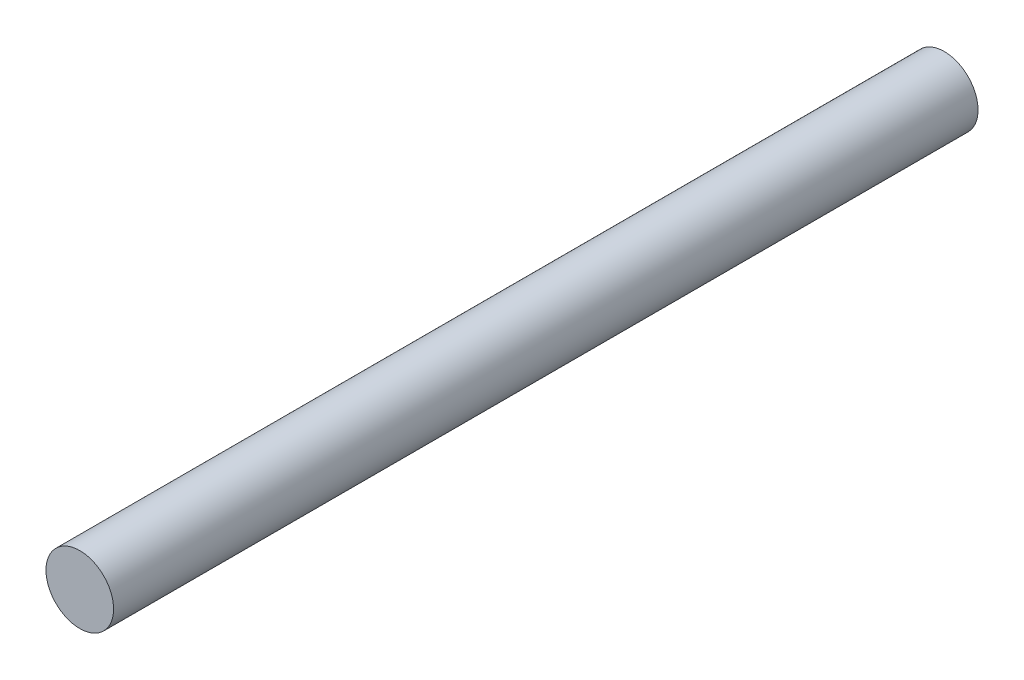
ISO-10303-21;
HEADER;
FILE_DESCRIPTION(('STEP AP214'),'2;1');
FILE_NAME('part.step','',(''),(''),'','','');
FILE_SCHEMA(('AUTOMOTIVE_DESIGN { 1 0 10303 214 1 1 1 1 }'));
ENDSEC;
DATA;
#1=APPLICATION_CONTEXT('core data for automotive mechanical design processes');
#2=APPLICATION_PROTOCOL_DEFINITION('international standard','automotive_design',2000,#1);
#3=PRODUCT_CONTEXT('',#1,'mechanical');
#4=PRODUCT('Part','Part','',(#3));
#5=PRODUCT_RELATED_PRODUCT_CATEGORY('part','',(#4));
#6=PRODUCT_DEFINITION_FORMATION('','',#4);
#7=PRODUCT_DEFINITION_CONTEXT('part definition',#1,'design');
#8=PRODUCT_DEFINITION('design','',#6,#7);
#9=PRODUCT_DEFINITION_SHAPE('','',#8);
#10=(LENGTH_UNIT() NAMED_UNIT(*) SI_UNIT(.MILLI.,.METRE.));
#11=(NAMED_UNIT(*) PLANE_ANGLE_UNIT() SI_UNIT($,.RADIAN.));
#12=(NAMED_UNIT(*) SI_UNIT($,.STERADIAN.) SOLID_ANGLE_UNIT());
#13=UNCERTAINTY_MEASURE_WITH_UNIT(LENGTH_MEASURE(1.E-05),#10,'distance_accuracy_value','');
#14=(GEOMETRIC_REPRESENTATION_CONTEXT(3) GLOBAL_UNCERTAINTY_ASSIGNED_CONTEXT((#13)) GLOBAL_UNIT_ASSIGNED_CONTEXT((#10,
#11,#12)) REPRESENTATION_CONTEXT('',''));
#15=CARTESIAN_POINT('',(0.,0.,0.));
#16=DIRECTION('',(0.,0.,1.));
#17=DIRECTION('',(1.,0.,0.));
#18=AXIS2_PLACEMENT_3D('',#15,#16,#17);
#19=CARTESIAN_POINT('',(0.,0.,1219.2));
#20=DIRECTION('',(0.,0.,-1.));
#21=DIRECTION('',(-1.,0.,0.));
#22=AXIS2_PLACEMENT_3D('',#19,#20,#21);
#23=CYLINDRICAL_SURFACE('',#22,47.6631);
#24=CARTESIAN_POINT('',(0.,0.,1219.2));
#25=DIRECTION('',(0.,0.,1.));
#26=DIRECTION('',(1.,0.,0.));
#27=AXIS2_PLACEMENT_3D('',#24,#25,#26);
#28=CIRCLE('',#27,47.6631);
#29=CARTESIAN_POINT('',(-47.6631,0.,1219.2));
#30=VERTEX_POINT('',#29);
#31=EDGE_CURVE('E10',#30,#30,#28,.T.);
#32=CARTESIAN_POINT('',(0.,0.,0.));
#33=DIRECTION('',(0.,0.,1.));
#34=DIRECTION('',(1.,0.,0.));
#35=AXIS2_PLACEMENT_3D('',#32,#33,#34);
#36=CIRCLE('',#35,47.6631);
#37=CARTESIAN_POINT('',(-47.6631,0.,0.));
#38=VERTEX_POINT('',#37);
#39=EDGE_CURVE('E41',#38,#38,#36,.T.);
#40=CARTESIAN_POINT('',(-47.6631,0.,1219.2));
#41=CARTESIAN_POINT('',(-47.6631,0.,1206.5));
#42=CARTESIAN_POINT('',(-47.6631,0.,1193.8));
#43=CARTESIAN_POINT('',(-47.6631,0.,1168.4));
#44=CARTESIAN_POINT('',(-47.6631,0.,1155.7));
#45=CARTESIAN_POINT('',(-47.6631,0.,1130.3));
#46=CARTESIAN_POINT('',(-47.6631,0.,1117.6));
#47=CARTESIAN_POINT('',(-47.6631,0.,1092.2));
#48=CARTESIAN_POINT('',(-47.6631,0.,1079.5));
#49=CARTESIAN_POINT('',(-47.6631,0.,1054.1));
#50=CARTESIAN_POINT('',(-47.6631,0.,1041.4));
#51=CARTESIAN_POINT('',(-47.6631,0.,1016.));
#52=CARTESIAN_POINT('',(-47.6631,0.,1003.3));
#53=CARTESIAN_POINT('',(-47.6631,0.,977.9));
#54=CARTESIAN_POINT('',(-47.6631,0.,965.2));
#55=CARTESIAN_POINT('',(-47.6631,0.,939.8));
#56=CARTESIAN_POINT('',(-47.6631,0.,927.1));
#57=CARTESIAN_POINT('',(-47.6631,0.,901.7));
#58=CARTESIAN_POINT('',(-47.6631,0.,889.));
#59=CARTESIAN_POINT('',(-47.6631,0.,863.6));
#60=CARTESIAN_POINT('',(-47.6631,0.,850.9));
#61=CARTESIAN_POINT('',(-47.6631,0.,825.5));
#62=CARTESIAN_POINT('',(-47.6631,0.,812.8));
#63=CARTESIAN_POINT('',(-47.6631,0.,787.4));
#64=CARTESIAN_POINT('',(-47.6631,0.,774.7));
#65=CARTESIAN_POINT('',(-47.6631,0.,749.3));
#66=CARTESIAN_POINT('',(-47.6631,0.,736.6));
#67=CARTESIAN_POINT('',(-47.6631,0.,711.2));
#68=CARTESIAN_POINT('',(-47.6631,0.,698.5));
#69=CARTESIAN_POINT('',(-47.6631,0.,673.1));
#70=CARTESIAN_POINT('',(-47.6631,0.,660.4));
#71=CARTESIAN_POINT('',(-47.6631,0.,635.));
#72=CARTESIAN_POINT('',(-47.6631,0.,622.3));
#73=CARTESIAN_POINT('',(-47.6631,0.,596.9));
#74=CARTESIAN_POINT('',(-47.6631,0.,584.2));
#75=CARTESIAN_POINT('',(-47.6631,0.,558.8));
#76=CARTESIAN_POINT('',(-47.6631,0.,546.1));
#77=CARTESIAN_POINT('',(-47.6631,0.,520.7));
#78=CARTESIAN_POINT('',(-47.6631,0.,508.));
#79=CARTESIAN_POINT('',(-47.6631,0.,482.6));
#80=CARTESIAN_POINT('',(-47.6631,0.,469.9));
#81=CARTESIAN_POINT('',(-47.6631,0.,444.5));
#82=CARTESIAN_POINT('',(-47.6631,0.,431.8));
#83=CARTESIAN_POINT('',(-47.6631,0.,406.4));
#84=CARTESIAN_POINT('',(-47.6631,0.,393.7));
#85=CARTESIAN_POINT('',(-47.6631,0.,368.3));
#86=CARTESIAN_POINT('',(-47.6631,0.,355.6));
#87=CARTESIAN_POINT('',(-47.6631,0.,330.2));
#88=CARTESIAN_POINT('',(-47.6631,0.,317.5));
#89=CARTESIAN_POINT('',(-47.6631,0.,292.1));
#90=CARTESIAN_POINT('',(-47.6631,0.,279.4));
#91=CARTESIAN_POINT('',(-47.6631,0.,254.));
#92=CARTESIAN_POINT('',(-47.6631,0.,241.3));
#93=CARTESIAN_POINT('',(-47.6631,0.,215.9));
#94=CARTESIAN_POINT('',(-47.6631,0.,203.2));
#95=CARTESIAN_POINT('',(-47.6631,0.,177.8));
#96=CARTESIAN_POINT('',(-47.6631,0.,165.1));
#97=CARTESIAN_POINT('',(-47.6631,0.,139.7));
#98=CARTESIAN_POINT('',(-47.6631,0.,127.));
#99=CARTESIAN_POINT('',(-47.6631,0.,101.6));
#100=CARTESIAN_POINT('',(-47.6631,0.,88.9));
#101=CARTESIAN_POINT('',(-47.6631,0.,63.5));
#102=CARTESIAN_POINT('',(-47.6631,0.,50.8));
#103=CARTESIAN_POINT('',(-47.6631,0.,25.4));
#104=CARTESIAN_POINT('',(-47.6631,0.,12.7));
#105=CARTESIAN_POINT('',(-47.6631,0.,0.));
#106=B_SPLINE_CURVE_WITH_KNOTS('',3,(#40,#41,#42,#43,#44,#45,#46,#47,#48,#49,#50,#51,#52,#53,
#54,#55,#56,#57,#58,#59,#60,#61,#62,#63,#64,#65,#66,#67,#68,#69,#70,#71,#72,#73,#74,#75,#76,#77,
#78,#79,#80,#81,#82,#83,#84,#85,#86,#87,#88,#89,#90,#91,#92,#93,#94,#95,#96,#97,#98,#99,#100,
#101,#102,#103,#104,#105),.UNSPECIFIED.,.F.,.F.,(4,2,2,2,2,2,2,2,2,2,2,2,2,2,2,2,2,2,2,2,2,2,2,
2,2,2,2,2,2,2,2,2,4),(0.,38.0999999999998,76.1999999999998,114.3,152.4,190.5,228.6,266.7,304.8,
342.9,381.,419.1,457.2,495.3,533.4,571.5,609.6,647.7,685.8,723.9,762.,800.1,838.2,876.3,914.4,
952.5,990.6,1028.7,1066.8,1104.9,1143.,1181.1,1219.2),.UNSPECIFIED.);
#107=EDGE_CURVE('BSEAM38',#30,#38,#106,.T.);
#108=ORIENTED_EDGE('',*,*,#31,.F.);
#109=ORIENTED_EDGE('',*,*,#39,.T.);
#110=ORIENTED_EDGE('',*,*,#107,.T.);
#111=ORIENTED_EDGE('',*,*,#107,.F.);
#112=EDGE_LOOP('',(#108,#110,#109,#111));
#113=FACE_BOUND('',#112,.T.);
#114=ADVANCED_FACE('F38',(#113),#23,.T.);
#115=CARTESIAN_POINT('',(0.,0.,1219.2));
#116=DIRECTION('',(0.,0.,1.));
#117=DIRECTION('',(1.,0.,0.));
#118=AXIS2_PLACEMENT_3D('',#115,#116,#117);
#119=PLANE('',#118);
#120=ORIENTED_EDGE('',*,*,#31,.T.);
#121=EDGE_LOOP('',(#120));
#122=FACE_BOUND('',#121,.T.);
#123=ADVANCED_FACE('F54',(#122),#119,.T.);
#124=CARTESIAN_POINT('',(0.,0.,0.));
#125=DIRECTION('',(0.,0.,1.));
#126=DIRECTION('',(1.,0.,0.));
#127=AXIS2_PLACEMENT_3D('',#124,#125,#126);
#128=PLANE('',#127);
#129=ORIENTED_EDGE('',*,*,#39,.F.);
#130=EDGE_LOOP('',(#129));
#131=FACE_BOUND('',#130,.T.);
#132=ADVANCED_FACE('F52',(#131),#128,.F.);
#133=CLOSED_SHELL('',(#114,#123,#132));
#134=MANIFOLD_SOLID_BREP('B2',#133);
#135=ADVANCED_BREP_SHAPE_REPRESENTATION('',(#18,#134),#14);
#136=SHAPE_DEFINITION_REPRESENTATION(#9,#135);
ENDSEC;
END-ISO-10303-21;
